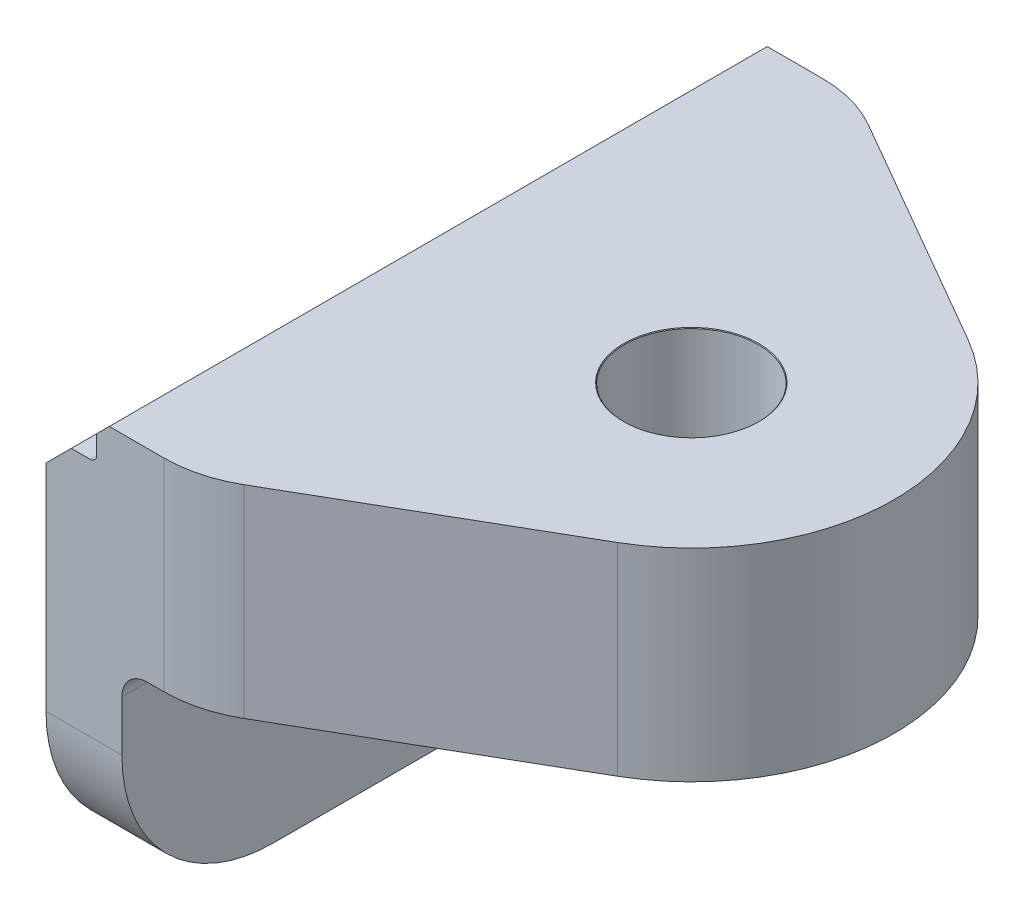
ISO-10303-21;
HEADER;
FILE_DESCRIPTION(('STEP AP214'),'2;1');
FILE_NAME('part.step','',(''),(''),'','','');
FILE_SCHEMA(('AUTOMOTIVE_DESIGN { 1 0 10303 214 1 1 1 1 }'));
ENDSEC;
DATA;
#1=APPLICATION_CONTEXT('core data for automotive mechanical design processes');
#2=APPLICATION_PROTOCOL_DEFINITION('international standard','automotive_design',2000,#1);
#3=PRODUCT_CONTEXT('',#1,'mechanical');
#4=PRODUCT('Part','Part','',(#3));
#5=PRODUCT_RELATED_PRODUCT_CATEGORY('part','',(#4));
#6=PRODUCT_DEFINITION_FORMATION('','',#4);
#7=PRODUCT_DEFINITION_CONTEXT('part definition',#1,'design');
#8=PRODUCT_DEFINITION('design','',#6,#7);
#9=PRODUCT_DEFINITION_SHAPE('','',#8);
#10=(LENGTH_UNIT() NAMED_UNIT(*) SI_UNIT(.MILLI.,.METRE.));
#11=(NAMED_UNIT(*) PLANE_ANGLE_UNIT() SI_UNIT($,.RADIAN.));
#12=(NAMED_UNIT(*) SI_UNIT($,.STERADIAN.) SOLID_ANGLE_UNIT());
#13=UNCERTAINTY_MEASURE_WITH_UNIT(LENGTH_MEASURE(1.E-05),#10,'distance_accuracy_value','');
#14=(GEOMETRIC_REPRESENTATION_CONTEXT(3) GLOBAL_UNCERTAINTY_ASSIGNED_CONTEXT((#13)) GLOBAL_UNIT_ASSIGNED_CONTEXT((#10,
#11,#12)) REPRESENTATION_CONTEXT('',''));
#15=CARTESIAN_POINT('',(0.,0.,0.));
#16=DIRECTION('',(0.,0.,1.));
#17=DIRECTION('',(1.,0.,0.));
#18=AXIS2_PLACEMENT_3D('',#15,#16,#17);
#19=CARTESIAN_POINT('',(3.,4.,13.));
#20=DIRECTION('',(0.,0.,-1.));
#21=DIRECTION('',(-1.,0.,0.));
#22=AXIS2_PLACEMENT_3D('',#19,#20,#21);
#23=PLANE('',#22);
#24=DIRECTION('',(1.,0.,0.));
#25=VECTOR('',#24,1.);
#26=CARTESIAN_POINT('',(3.,4.,13.));
#27=LINE('',#26,#25);
#28=CARTESIAN_POINT('',(-0.499999999999993,4.,13.));
#29=VERTEX_POINT('',#28);
#30=CARTESIAN_POINT('',(1.6602540378444,4.,13.));
#31=VERTEX_POINT('',#30);
#32=EDGE_CURVE('E236',#29,#31,#27,.T.);
#33=ORIENTED_EDGE('',*,*,#32,.F.);
#34=DIRECTION('',(-0.707106781186545,-0.70710678118655,0.));
#35=VECTOR('',#34,1.);
#36=CARTESIAN_POINT('',(-0.499999999999993,4.,13.));
#37=LINE('',#36,#35);
#38=CARTESIAN_POINT('',(-1.,3.49999999999999,13.));
#39=VERTEX_POINT('',#38);
#40=EDGE_CURVE('E69',#29,#39,#37,.T.);
#41=ORIENTED_EDGE('',*,*,#40,.T.);
#42=DIRECTION('',(0.,1.,0.));
#43=VECTOR('',#42,1.);
#44=CARTESIAN_POINT('',(-1.,2.,13.));
#45=LINE('',#44,#43);
#46=CARTESIAN_POINT('',(-1.,2.75,13.));
#47=VERTEX_POINT('',#46);
#48=EDGE_CURVE('E515',#47,#39,#45,.T.);
#49=ORIENTED_EDGE('',*,*,#48,.F.);
#50=CARTESIAN_POINT('',(-1.25,2.75,13.));
#51=DIRECTION('',(0.,0.,-1.));
#52=DIRECTION('',(-1.,0.,0.));
#53=AXIS2_PLACEMENT_3D('',#50,#51,#52);
#54=CIRCLE('',#53,0.25);
#55=CARTESIAN_POINT('',(-1.25,2.5,13.));
#56=VERTEX_POINT('',#55);
#57=EDGE_CURVE('E355',#47,#56,#54,.T.);
#58=ORIENTED_EDGE('',*,*,#57,.T.);
#59=DIRECTION('',(1.,0.,0.));
#60=VECTOR('',#59,1.);
#61=CARTESIAN_POINT('',(0.,2.5,13.));
#62=LINE('',#61,#60);
#63=CARTESIAN_POINT('',(-1.99999999999999,2.5,13.));
#64=VERTEX_POINT('',#63);
#65=EDGE_CURVE('E210',#64,#56,#62,.T.);
#66=ORIENTED_EDGE('',*,*,#65,.F.);
#67=DIRECTION('',(-0.707106781186548,-0.707106781186547,0.));
#68=VECTOR('',#67,1.);
#69=CARTESIAN_POINT('',(-1.99999999999999,2.5,13.));
#70=LINE('',#69,#68);
#71=CARTESIAN_POINT('',(-3.,1.5,13.));
#72=VERTEX_POINT('',#71);
#73=EDGE_CURVE('E363',#64,#72,#70,.T.);
#74=ORIENTED_EDGE('',*,*,#73,.T.);
#75=DIRECTION('',(0.,1.,0.));
#76=VECTOR('',#75,1.);
#77=CARTESIAN_POINT('',(-3.,-13.,13.));
#78=LINE('',#77,#76);
#79=CARTESIAN_POINT('',(-3.,-7.,13.));
#80=VERTEX_POINT('',#79);
#81=EDGE_CURVE('E225',#80,#72,#78,.T.);
#82=ORIENTED_EDGE('',*,*,#81,.F.);
#83=DIRECTION('',(1.,0.,0.));
#84=VECTOR('',#83,1.);
#85=CARTESIAN_POINT('',(0.,-7.,13.));
#86=LINE('',#85,#84);
#87=CARTESIAN_POINT('',(0.,-7.,13.));
#88=VERTEX_POINT('',#87);
#89=EDGE_CURVE('E278',#80,#88,#86,.T.);
#90=ORIENTED_EDGE('',*,*,#89,.T.);
#91=DIRECTION('',(0.,1.,0.));
#92=VECTOR('',#91,1.);
#93=CARTESIAN_POINT('',(0.,-13.,13.));
#94=LINE('',#93,#92);
#95=CARTESIAN_POINT('',(0.,-5.,13.));
#96=VERTEX_POINT('',#95);
#97=EDGE_CURVE('E220',#88,#96,#94,.T.);
#98=ORIENTED_EDGE('',*,*,#97,.T.);
#99=CARTESIAN_POINT('',(1.,-5.,13.));
#100=DIRECTION('',(0.,0.,-1.));
#101=DIRECTION('',(-1.,0.,0.));
#102=AXIS2_PLACEMENT_3D('',#99,#100,#101);
#103=CIRCLE('',#102,1.);
#104=CARTESIAN_POINT('',(1.,-4.,13.));
#105=VERTEX_POINT('',#104);
#106=EDGE_CURVE('E312',#96,#105,#103,.T.);
#107=ORIENTED_EDGE('',*,*,#106,.T.);
#108=DIRECTION('',(1.,0.,0.));
#109=VECTOR('',#108,1.);
#110=CARTESIAN_POINT('',(3.,-4.,13.));
#111=LINE('',#110,#109);
#112=CARTESIAN_POINT('',(1.6602540378444,-4.,13.));
#113=VERTEX_POINT('',#112);
#114=EDGE_CURVE('E224',#105,#113,#111,.T.);
#115=ORIENTED_EDGE('',*,*,#114,.T.);
#116=DIRECTION('',(0.,-1.,0.));
#117=VECTOR('',#116,1.);
#118=CARTESIAN_POINT('',(1.6602540378444,4.,13.));
#119=LINE('',#118,#117);
#120=EDGE_CURVE('E341',#113,#31,#119,.F.);
#121=ORIENTED_EDGE('',*,*,#120,.T.);
#122=EDGE_LOOP('',(#33,#41,#49,#58,#66,#74,#82,#90,#98,#107,#115,#121));
#123=FACE_BOUND('',#122,.T.);
#124=ADVANCED_FACE('F45',(#123),#23,.F.);
#125=CARTESIAN_POINT('',(25.5166604983955,4.,0.));
#126=DIRECTION('',(-0.499999999999995,0.,-0.866025403784441));
#127=DIRECTION('',(-0.866025403784441,0.,0.499999999999995));
#128=AXIS2_PLACEMENT_3D('',#125,#126,#127);
#129=PLANE('',#128);
#130=DIRECTION('',(0.866025403784441,0.,-0.499999999999995));
#131=VECTOR('',#130,1.);
#132=CARTESIAN_POINT('',(25.5166604983955,4.,0.));
#133=LINE('',#132,#131);
#134=CARTESIAN_POINT('',(4.16025403784439,4.,12.3301270189222));
#135=VERTEX_POINT('',#134);
#136=CARTESIAN_POINT('',(13.5166604983954,4.,6.92820323027558));
#137=VERTEX_POINT('',#136);
#138=EDGE_CURVE('E239',#135,#137,#133,.T.);
#139=ORIENTED_EDGE('',*,*,#138,.F.);
#140=DIRECTION('',(0.,-1.,0.));
#141=VECTOR('',#140,1.);
#142=CARTESIAN_POINT('',(4.16025403784438,4.,12.3301270189222));
#143=LINE('',#142,#141);
#144=CARTESIAN_POINT('',(4.16025403784439,-4.,12.3301270189222));
#145=VERTEX_POINT('',#144);
#146=EDGE_CURVE('E337',#135,#145,#143,.T.);
#147=ORIENTED_EDGE('',*,*,#146,.T.);
#148=DIRECTION('',(0.866025403784441,0.,-0.499999999999995));
#149=VECTOR('',#148,1.);
#150=CARTESIAN_POINT('',(25.5166604983955,-4.,0.));
#151=LINE('',#150,#149);
#152=CARTESIAN_POINT('',(13.5166604983954,-4.,6.92820323027558));
#153=VERTEX_POINT('',#152);
#154=EDGE_CURVE('E255',#145,#153,#151,.T.);
#155=ORIENTED_EDGE('',*,*,#154,.T.);
#156=DIRECTION('',(0.,-1.,0.));
#157=VECTOR('',#156,1.);
#158=CARTESIAN_POINT('',(13.5166604983954,4.,6.92820323027558));
#159=LINE('',#158,#157);
#160=EDGE_CURVE('E271',#153,#137,#159,.F.);
#161=ORIENTED_EDGE('',*,*,#160,.T.);
#162=EDGE_LOOP('',(#139,#147,#155,#161));
#163=FACE_BOUND('',#162,.T.);
#164=ADVANCED_FACE('F446',(#163),#129,.F.);
#165=CARTESIAN_POINT('',(3.,4.,-13.));
#166=DIRECTION('',(-0.500000000000001,0.,0.866025403784438));
#167=DIRECTION('',(0.866025403784438,0.,0.500000000000001));
#168=AXIS2_PLACEMENT_3D('',#165,#166,#167);
#169=PLANE('',#168);
#170=DIRECTION('',(-0.866025403784438,0.,-0.500000000000001));
#171=VECTOR('',#170,1.);
#172=CARTESIAN_POINT('',(3.,-4.,-13.));
#173=LINE('',#172,#171);
#174=CARTESIAN_POINT('',(13.5166604983955,-4.,-6.92820323027546));
#175=VERTEX_POINT('',#174);
#176=CARTESIAN_POINT('',(4.16025403784439,-4.,-12.3301270189222));
#177=VERTEX_POINT('',#176);
#178=EDGE_CURVE('E258',#175,#177,#173,.T.);
#179=ORIENTED_EDGE('',*,*,#178,.T.);
#180=DIRECTION('',(0.,-1.,0.));
#181=VECTOR('',#180,1.);
#182=CARTESIAN_POINT('',(4.16025403784439,4.,-12.3301270189222));
#183=LINE('',#182,#181);
#184=CARTESIAN_POINT('',(4.16025403784439,4.,-12.3301270189222));
#185=VERTEX_POINT('',#184);
#186=EDGE_CURVE('E328',#177,#185,#183,.F.);
#187=ORIENTED_EDGE('',*,*,#186,.T.);
#188=DIRECTION('',(-0.866025403784438,0.,-0.500000000000001));
#189=VECTOR('',#188,1.);
#190=CARTESIAN_POINT('',(3.,4.,-13.));
#191=LINE('',#190,#189);
#192=CARTESIAN_POINT('',(13.5166604983955,4.,-6.92820323027546));
#193=VERTEX_POINT('',#192);
#194=EDGE_CURVE('E243',#193,#185,#191,.T.);
#195=ORIENTED_EDGE('',*,*,#194,.F.);
#196=DIRECTION('',(0.,-1.,0.));
#197=VECTOR('',#196,1.);
#198=CARTESIAN_POINT('',(13.5166604983955,4.,-6.92820323027546));
#199=LINE('',#198,#197);
#200=EDGE_CURVE('E251',#193,#175,#199,.T.);
#201=ORIENTED_EDGE('',*,*,#200,.T.);
#202=EDGE_LOOP('',(#179,#187,#195,#201));
#203=FACE_BOUND('',#202,.T.);
#204=ADVANCED_FACE('F456',(#203),#169,.F.);
#205=CARTESIAN_POINT('',(0.,4.,-13.));
#206=DIRECTION('',(0.,0.,1.));
#207=DIRECTION('',(1.,0.,0.));
#208=AXIS2_PLACEMENT_3D('',#205,#206,#207);
#209=PLANE('',#208);
#210=DIRECTION('',(0.,1.,0.));
#211=VECTOR('',#210,1.);
#212=CARTESIAN_POINT('',(-1.,2.,-13.));
#213=LINE('',#212,#211);
#214=CARTESIAN_POINT('',(-1.,2.75,-13.));
#215=VERTEX_POINT('',#214);
#216=CARTESIAN_POINT('',(-1.,3.49999999999999,-13.));
#217=VERTEX_POINT('',#216);
#218=EDGE_CURVE('E465',#215,#217,#213,.T.);
#219=ORIENTED_EDGE('',*,*,#218,.T.);
#220=DIRECTION('',(0.707106781186545,0.70710678118655,0.));
#221=VECTOR('',#220,1.);
#222=CARTESIAN_POINT('',(-0.5,3.99999999999999,-13.));
#223=LINE('',#222,#221);
#224=CARTESIAN_POINT('',(-0.499999999999993,4.,-13.));
#225=VERTEX_POINT('',#224);
#226=EDGE_CURVE('E11',#217,#225,#223,.T.);
#227=ORIENTED_EDGE('',*,*,#226,.T.);
#228=DIRECTION('',(-1.,0.,0.));
#229=VECTOR('',#228,1.);
#230=CARTESIAN_POINT('',(0.,4.,-13.));
#231=LINE('',#230,#229);
#232=CARTESIAN_POINT('',(1.66025403784438,4.,-13.));
#233=VERTEX_POINT('',#232);
#234=EDGE_CURVE('E247',#233,#225,#231,.T.);
#235=ORIENTED_EDGE('',*,*,#234,.F.);
#236=DIRECTION('',(0.,-1.,0.));
#237=VECTOR('',#236,1.);
#238=CARTESIAN_POINT('',(1.66025403784438,4.,-13.));
#239=LINE('',#238,#237);
#240=CARTESIAN_POINT('',(1.66025403784438,-4.,-13.));
#241=VERTEX_POINT('',#240);
#242=EDGE_CURVE('E318',#233,#241,#239,.T.);
#243=ORIENTED_EDGE('',*,*,#242,.T.);
#244=DIRECTION('',(-1.,0.,0.));
#245=VECTOR('',#244,1.);
#246=CARTESIAN_POINT('',(0.,-4.,-13.));
#247=LINE('',#246,#245);
#248=CARTESIAN_POINT('',(0.999999999999999,-4.,-13.));
#249=VERTEX_POINT('',#248);
#250=EDGE_CURVE('E240',#241,#249,#247,.T.);
#251=ORIENTED_EDGE('',*,*,#250,.T.);
#252=CARTESIAN_POINT('',(0.999999999999999,-5.,-13.));
#253=DIRECTION('',(0.,0.,1.));
#254=DIRECTION('',(1.,0.,0.));
#255=AXIS2_PLACEMENT_3D('',#252,#253,#254);
#256=CIRCLE('',#255,1.);
#257=CARTESIAN_POINT('',(0.,-5.,-13.));
#258=VERTEX_POINT('',#257);
#259=EDGE_CURVE('E315',#249,#258,#256,.T.);
#260=ORIENTED_EDGE('',*,*,#259,.T.);
#261=DIRECTION('',(0.,1.,0.));
#262=VECTOR('',#261,1.);
#263=CARTESIAN_POINT('',(0.,-13.,-13.));
#264=LINE('',#263,#262);
#265=CARTESIAN_POINT('',(0.,-7.,-13.));
#266=VERTEX_POINT('',#265);
#267=EDGE_CURVE('E214',#266,#258,#264,.T.);
#268=ORIENTED_EDGE('',*,*,#267,.F.);
#269=DIRECTION('',(-1.,0.,0.));
#270=VECTOR('',#269,1.);
#271=CARTESIAN_POINT('',(-3.,-7.,-13.));
#272=LINE('',#271,#270);
#273=CARTESIAN_POINT('',(-3.,-7.,-13.));
#274=VERTEX_POINT('',#273);
#275=EDGE_CURVE('E300',#266,#274,#272,.T.);
#276=ORIENTED_EDGE('',*,*,#275,.T.);
#277=DIRECTION('',(0.,1.,0.));
#278=VECTOR('',#277,1.);
#279=CARTESIAN_POINT('',(-3.,-13.,-13.));
#280=LINE('',#279,#278);
#281=CARTESIAN_POINT('',(-3.,1.5,-13.));
#282=VERTEX_POINT('',#281);
#283=EDGE_CURVE('E229',#274,#282,#280,.T.);
#284=ORIENTED_EDGE('',*,*,#283,.T.);
#285=DIRECTION('',(0.707106781186548,0.707106781186547,0.));
#286=VECTOR('',#285,1.);
#287=CARTESIAN_POINT('',(-2.,2.49999999999999,-13.));
#288=LINE('',#287,#286);
#289=CARTESIAN_POINT('',(-2.,2.5,-13.));
#290=VERTEX_POINT('',#289);
#291=EDGE_CURVE('E369',#282,#290,#288,.T.);
#292=ORIENTED_EDGE('',*,*,#291,.T.);
#293=DIRECTION('',(-1.,0.,0.));
#294=VECTOR('',#293,1.);
#295=CARTESIAN_POINT('',(0.,2.5,-13.));
#296=LINE('',#295,#294);
#297=CARTESIAN_POINT('',(-1.25,2.5,-13.));
#298=VERTEX_POINT('',#297);
#299=EDGE_CURVE('E204',#298,#290,#296,.T.);
#300=ORIENTED_EDGE('',*,*,#299,.F.);
#301=CARTESIAN_POINT('',(-1.25,2.75,-13.));
#302=DIRECTION('',(0.,0.,1.));
#303=DIRECTION('',(1.,0.,0.));
#304=AXIS2_PLACEMENT_3D('',#301,#302,#303);
#305=CIRCLE('',#304,0.25);
#306=EDGE_CURVE('E352',#298,#215,#305,.T.);
#307=ORIENTED_EDGE('',*,*,#306,.T.);
#308=EDGE_LOOP('',(#219,#227,#235,#243,#251,#260,#268,#276,#284,#292,#300,#307));
#309=FACE_BOUND('',#308,.T.);
#310=ADVANCED_FACE('F463',(#309),#209,.F.);
#311=CARTESIAN_POINT('',(0.,4.,0.));
#312=DIRECTION('',(0.,-1.,0.));
#313=DIRECTION('',(0.,0.,-1.));
#314=AXIS2_PLACEMENT_3D('',#311,#312,#313);
#315=PLANE('',#314);
#316=CARTESIAN_POINT('',(9.5,4.,0.));
#317=DIRECTION('',(0.,-1.,0.));
#318=DIRECTION('',(0.,0.,-1.));
#319=AXIS2_PLACEMENT_3D('',#316,#317,#318);
#320=CIRCLE('',#319,2.675);
#321=CARTESIAN_POINT('',(9.5,4.,-2.675));
#322=VERTEX_POINT('',#321);
#323=EDGE_CURVE('E887',#322,#322,#320,.T.);
#324=ORIENTED_EDGE('',*,*,#323,.T.);
#325=EDGE_LOOP('',(#324));
#326=FACE_BOUND('',#325,.T.);
#327=ORIENTED_EDGE('',*,*,#234,.T.);
#328=DIRECTION('',(0.,0.,1.));
#329=VECTOR('',#328,1.);
#330=CARTESIAN_POINT('',(-0.499999999999993,4.,13.));
#331=LINE('',#330,#329);
#332=EDGE_CURVE('E372',#225,#29,#331,.T.);
#333=ORIENTED_EDGE('',*,*,#332,.T.);
#334=ORIENTED_EDGE('',*,*,#32,.T.);
#335=CARTESIAN_POINT('',(1.6602540378444,4.,8.));
#336=DIRECTION('',(0.,-1.,0.));
#337=DIRECTION('',(0.,0.,-1.));
#338=AXIS2_PLACEMENT_3D('',#335,#336,#337);
#339=CIRCLE('',#338,5.);
#340=EDGE_CURVE('E331',#31,#135,#339,.F.);
#341=ORIENTED_EDGE('',*,*,#340,.T.);
#342=ORIENTED_EDGE('',*,*,#138,.T.);
#343=CARTESIAN_POINT('',(9.51666049839545,4.,0.));
#344=DIRECTION('',(0.,-1.,0.));
#345=DIRECTION('',(0.,0.,-1.));
#346=AXIS2_PLACEMENT_3D('',#343,#344,#345);
#347=CIRCLE('',#346,8.);
#348=EDGE_CURVE('E275',#137,#193,#347,.F.);
#349=ORIENTED_EDGE('',*,*,#348,.T.);
#350=ORIENTED_EDGE('',*,*,#194,.T.);
#351=CARTESIAN_POINT('',(1.66025403784439,4.,-8.));
#352=DIRECTION('',(0.,-1.,0.));
#353=DIRECTION('',(0.,0.,-1.));
#354=AXIS2_PLACEMENT_3D('',#351,#352,#353);
#355=CIRCLE('',#354,5.);
#356=EDGE_CURVE('E334',#185,#233,#355,.F.);
#357=ORIENTED_EDGE('',*,*,#356,.T.);
#358=EDGE_LOOP('',(#327,#333,#334,#341,#342,#349,#350,#357));
#359=FACE_BOUND('',#358,.T.);
#360=ADVANCED_FACE('F434',(#326,#359),#315,.F.);
#361=CARTESIAN_POINT('',(0.,-4.,0.));
#362=DIRECTION('',(0.,-1.,0.));
#363=DIRECTION('',(0.,0.,-1.));
#364=AXIS2_PLACEMENT_3D('',#361,#362,#363);
#365=PLANE('',#364);
#366=CARTESIAN_POINT('',(9.5,-4.,0.));
#367=DIRECTION('',(0.,-1.,0.));
#368=DIRECTION('',(0.,0.,-1.));
#369=AXIS2_PLACEMENT_3D('',#366,#367,#368);
#370=CIRCLE('',#369,5.);
#371=CARTESIAN_POINT('',(9.5,-4.,-5.));
#372=VERTEX_POINT('',#371);
#373=EDGE_CURVE('E885',#372,#372,#370,.T.);
#374=ORIENTED_EDGE('',*,*,#373,.F.);
#375=EDGE_LOOP('',(#374));
#376=FACE_BOUND('',#375,.T.);
#377=ORIENTED_EDGE('',*,*,#250,.F.);
#378=CARTESIAN_POINT('',(1.66025403784439,-4.,-8.));
#379=DIRECTION('',(0.,-1.,0.));
#380=DIRECTION('',(0.,0.,-1.));
#381=AXIS2_PLACEMENT_3D('',#378,#379,#380);
#382=CIRCLE('',#381,5.);
#383=EDGE_CURVE('E325',#241,#177,#382,.T.);
#384=ORIENTED_EDGE('',*,*,#383,.T.);
#385=ORIENTED_EDGE('',*,*,#178,.F.);
#386=CARTESIAN_POINT('',(9.51666049839545,-4.,0.));
#387=DIRECTION('',(0.,-1.,0.));
#388=DIRECTION('',(0.,0.,-1.));
#389=AXIS2_PLACEMENT_3D('',#386,#387,#388);
#390=CIRCLE('',#389,8.);
#391=EDGE_CURVE('E267',#175,#153,#390,.T.);
#392=ORIENTED_EDGE('',*,*,#391,.T.);
#393=ORIENTED_EDGE('',*,*,#154,.F.);
#394=CARTESIAN_POINT('',(1.6602540378444,-4.,8.));
#395=DIRECTION('',(0.,-1.,0.));
#396=DIRECTION('',(0.,0.,-1.));
#397=AXIS2_PLACEMENT_3D('',#394,#395,#396);
#398=CIRCLE('',#397,5.);
#399=EDGE_CURVE('E322',#145,#113,#398,.T.);
#400=ORIENTED_EDGE('',*,*,#399,.T.);
#401=ORIENTED_EDGE('',*,*,#114,.F.);
#402=DIRECTION('',(0.,0.,1.));
#403=VECTOR('',#402,1.);
#404=CARTESIAN_POINT('',(0.999999999999999,-4.,-13.));
#405=LINE('',#404,#403);
#406=EDGE_CURVE('E308',#105,#249,#405,.F.);
#407=ORIENTED_EDGE('',*,*,#406,.T.);
#408=EDGE_LOOP('',(#377,#384,#385,#392,#393,#400,#401,#407));
#409=FACE_BOUND('',#408,.T.);
#410=ADVANCED_FACE('F484',(#376,#409),#365,.T.);
#411=CARTESIAN_POINT('',(9.51666049839545,4.,0.));
#412=DIRECTION('',(0.,-1.,0.));
#413=DIRECTION('',(0.,0.,-1.));
#414=AXIS2_PLACEMENT_3D('',#411,#412,#413);
#415=CYLINDRICAL_SURFACE('',#414,8.);
#416=ORIENTED_EDGE('',*,*,#348,.F.);
#417=ORIENTED_EDGE('',*,*,#160,.F.);
#418=ORIENTED_EDGE('',*,*,#391,.F.);
#419=ORIENTED_EDGE('',*,*,#200,.F.);
#420=EDGE_LOOP('',(#416,#417,#418,#419));
#421=FACE_BOUND('',#420,.T.);
#422=ADVANCED_FACE('F452',(#421),#415,.T.);
#423=CARTESIAN_POINT('',(0.,-13.,-13.));
#424=DIRECTION('',(1.,0.,0.));
#425=DIRECTION('',(0.,0.,-1.));
#426=AXIS2_PLACEMENT_3D('',#423,#424,#425);
#427=PLANE('',#426);
#428=CARTESIAN_POINT('',(0.,-8.,-5.));
#429=DIRECTION('',(1.,0.,0.));
#430=DIRECTION('',(0.,0.,-1.));
#431=AXIS2_PLACEMENT_3D('',#428,#429,#430);
#432=CIRCLE('',#431,1.7);
#433=CARTESIAN_POINT('',(0.,-8.,-6.7));
#434=VERTEX_POINT('',#433);
#435=EDGE_CURVE('E523',#434,#434,#432,.T.);
#436=ORIENTED_EDGE('',*,*,#435,.F.);
#437=EDGE_LOOP('',(#436));
#438=FACE_BOUND('',#437,.T.);
#439=CARTESIAN_POINT('',(0.,-8.,5.));
#440=DIRECTION('',(1.,0.,0.));
#441=DIRECTION('',(0.,0.,-1.));
#442=AXIS2_PLACEMENT_3D('',#439,#440,#441);
#443=CIRCLE('',#442,1.7);
#444=CARTESIAN_POINT('',(0.,-8.,3.3));
#445=VERTEX_POINT('',#444);
#446=EDGE_CURVE('E197',#445,#445,#443,.T.);
#447=ORIENTED_EDGE('',*,*,#446,.F.);
#448=EDGE_LOOP('',(#447));
#449=FACE_BOUND('',#448,.T.);
#450=ORIENTED_EDGE('',*,*,#267,.T.);
#451=DIRECTION('',(0.,0.,1.));
#452=VECTOR('',#451,1.);
#453=CARTESIAN_POINT('',(0.,-5.,13.));
#454=LINE('',#453,#452);
#455=EDGE_CURVE('E304',#258,#96,#454,.T.);
#456=ORIENTED_EDGE('',*,*,#455,.T.);
#457=ORIENTED_EDGE('',*,*,#97,.F.);
#458=CARTESIAN_POINT('',(0.,-7.,7.));
#459=DIRECTION('',(1.,0.,0.));
#460=DIRECTION('',(0.,0.,-1.));
#461=AXIS2_PLACEMENT_3D('',#458,#459,#460);
#462=CIRCLE('',#461,6.);
#463=CARTESIAN_POINT('',(0.,-13.,6.99999999999999));
#464=VERTEX_POINT('',#463);
#465=EDGE_CURVE('E285',#88,#464,#462,.T.);
#466=ORIENTED_EDGE('',*,*,#465,.T.);
#467=DIRECTION('',(0.,0.,-1.));
#468=VECTOR('',#467,1.);
#469=CARTESIAN_POINT('',(0.,-13.,-13.));
#470=LINE('',#469,#468);
#471=CARTESIAN_POINT('',(0.,-13.,-7.));
#472=VERTEX_POINT('',#471);
#473=EDGE_CURVE('E205',#464,#472,#470,.T.);
#474=ORIENTED_EDGE('',*,*,#473,.T.);
#475=CARTESIAN_POINT('',(0.,-7.,-7.));
#476=DIRECTION('',(1.,0.,0.));
#477=DIRECTION('',(0.,0.,-1.));
#478=AXIS2_PLACEMENT_3D('',#475,#476,#477);
#479=CIRCLE('',#478,6.);
#480=EDGE_CURVE('E282',#472,#266,#479,.T.);
#481=ORIENTED_EDGE('',*,*,#480,.T.);
#482=EDGE_LOOP('',(#450,#456,#457,#466,#474,#481));
#483=FACE_BOUND('',#482,.T.);
#484=ADVANCED_FACE('F483',(#438,#449,#483),#427,.T.);
#485=CARTESIAN_POINT('',(-3.,-13.,-13.));
#486=DIRECTION('',(-1.,0.,0.));
#487=DIRECTION('',(0.,0.,1.));
#488=AXIS2_PLACEMENT_3D('',#485,#486,#487);
#489=PLANE('',#488);
#490=CARTESIAN_POINT('',(-3.,-8.,-5.));
#491=DIRECTION('',(-1.,0.,0.));
#492=DIRECTION('',(0.,0.,1.));
#493=AXIS2_PLACEMENT_3D('',#490,#491,#492);
#494=CIRCLE('',#493,1.7);
#495=CARTESIAN_POINT('',(-3.,-8.,-3.3));
#496=VERTEX_POINT('',#495);
#497=EDGE_CURVE('E517',#496,#496,#494,.T.);
#498=ORIENTED_EDGE('',*,*,#497,.F.);
#499=EDGE_LOOP('',(#498));
#500=FACE_BOUND('',#499,.T.);
#501=CARTESIAN_POINT('',(-3.,-8.,5.));
#502=DIRECTION('',(-1.,0.,0.));
#503=DIRECTION('',(0.,0.,1.));
#504=AXIS2_PLACEMENT_3D('',#501,#502,#503);
#505=CIRCLE('',#504,1.7);
#506=CARTESIAN_POINT('',(-3.,-8.,6.7));
#507=VERTEX_POINT('',#506);
#508=EDGE_CURVE('E533',#507,#507,#505,.T.);
#509=ORIENTED_EDGE('',*,*,#508,.F.);
#510=EDGE_LOOP('',(#509));
#511=FACE_BOUND('',#510,.T.);
#512=CARTESIAN_POINT('',(-3.,-1.,9.5));
#513=DIRECTION('',(-1.,0.,0.));
#514=DIRECTION('',(0.,0.,1.));
#515=AXIS2_PLACEMENT_3D('',#512,#513,#514);
#516=CIRCLE('',#515,1.25);
#517=CARTESIAN_POINT('',(-3.,-1.,10.75));
#518=VERTEX_POINT('',#517);
#519=EDGE_CURVE('E188',#518,#518,#516,.T.);
#520=ORIENTED_EDGE('',*,*,#519,.F.);
#521=EDGE_LOOP('',(#520));
#522=FACE_BOUND('',#521,.T.);
#523=CARTESIAN_POINT('',(-3.,-1.,-9.5));
#524=DIRECTION('',(-1.,0.,0.));
#525=DIRECTION('',(0.,0.,1.));
#526=AXIS2_PLACEMENT_3D('',#523,#524,#525);
#527=CIRCLE('',#526,1.25);
#528=CARTESIAN_POINT('',(-3.,-1.,-8.25));
#529=VERTEX_POINT('',#528);
#530=EDGE_CURVE('E187',#529,#529,#527,.T.);
#531=ORIENTED_EDGE('',*,*,#530,.F.);
#532=EDGE_LOOP('',(#531));
#533=FACE_BOUND('',#532,.T.);
#534=ORIENTED_EDGE('',*,*,#81,.T.);
#535=DIRECTION('',(0.,0.,-1.));
#536=VECTOR('',#535,1.);
#537=CARTESIAN_POINT('',(-3.,1.5,-13.));
#538=LINE('',#537,#536);
#539=EDGE_CURVE('E366',#72,#282,#538,.T.);
#540=ORIENTED_EDGE('',*,*,#539,.T.);
#541=ORIENTED_EDGE('',*,*,#283,.F.);
#542=CARTESIAN_POINT('',(-3.,-7.,-6.99999999999999));
#543=DIRECTION('',(-1.,0.,0.));
#544=DIRECTION('',(0.,0.,1.));
#545=AXIS2_PLACEMENT_3D('',#542,#543,#544);
#546=CIRCLE('',#545,6.);
#547=CARTESIAN_POINT('',(-3.,-13.,-7.));
#548=VERTEX_POINT('',#547);
#549=EDGE_CURVE('E294',#274,#548,#546,.T.);
#550=ORIENTED_EDGE('',*,*,#549,.T.);
#551=DIRECTION('',(0.,0.,1.));
#552=VECTOR('',#551,1.);
#553=CARTESIAN_POINT('',(-3.,-13.,-13.));
#554=LINE('',#553,#552);
#555=CARTESIAN_POINT('',(-3.,-13.,6.99999999999999));
#556=VERTEX_POINT('',#555);
#557=EDGE_CURVE('E209',#548,#556,#554,.T.);
#558=ORIENTED_EDGE('',*,*,#557,.T.);
#559=CARTESIAN_POINT('',(-3.,-7.,7.));
#560=DIRECTION('',(-1.,0.,0.));
#561=DIRECTION('',(0.,0.,1.));
#562=AXIS2_PLACEMENT_3D('',#559,#560,#561);
#563=CIRCLE('',#562,6.);
#564=EDGE_CURVE('E297',#556,#80,#563,.T.);
#565=ORIENTED_EDGE('',*,*,#564,.T.);
#566=EDGE_LOOP('',(#534,#540,#541,#550,#558,#565));
#567=FACE_BOUND('',#566,.T.);
#568=ADVANCED_FACE('F546',(#500,#511,#522,#533,#567),#489,.T.);
#569=CARTESIAN_POINT('',(0.,-13.,0.));
#570=DIRECTION('',(0.,-1.,0.));
#571=DIRECTION('',(0.,0.,-1.));
#572=AXIS2_PLACEMENT_3D('',#569,#570,#571);
#573=PLANE('',#572);
#574=ORIENTED_EDGE('',*,*,#473,.F.);
#575=DIRECTION('',(1.,0.,0.));
#576=VECTOR('',#575,1.);
#577=CARTESIAN_POINT('',(-3.,-13.,7.));
#578=LINE('',#577,#576);
#579=EDGE_CURVE('E291',#464,#556,#578,.F.);
#580=ORIENTED_EDGE('',*,*,#579,.T.);
#581=ORIENTED_EDGE('',*,*,#557,.F.);
#582=DIRECTION('',(-1.,0.,0.));
#583=VECTOR('',#582,1.);
#584=CARTESIAN_POINT('',(0.,-13.,-7.));
#585=LINE('',#584,#583);
#586=EDGE_CURVE('E288',#548,#472,#585,.F.);
#587=ORIENTED_EDGE('',*,*,#586,.T.);
#588=EDGE_LOOP('',(#574,#580,#581,#587));
#589=FACE_BOUND('',#588,.T.);
#590=ADVANCED_FACE('F611',(#589),#573,.T.);
#591=CARTESIAN_POINT('',(0.,2.5,0.));
#592=DIRECTION('',(0.,-1.,0.));
#593=DIRECTION('',(0.,0.,-1.));
#594=AXIS2_PLACEMENT_3D('',#591,#592,#593);
#595=PLANE('',#594);
#596=ORIENTED_EDGE('',*,*,#299,.T.);
#597=DIRECTION('',(0.,0.,1.));
#598=VECTOR('',#597,1.);
#599=CARTESIAN_POINT('',(-1.99999999999999,2.5,13.));
#600=LINE('',#599,#598);
#601=EDGE_CURVE('E359',#290,#64,#600,.T.);
#602=ORIENTED_EDGE('',*,*,#601,.T.);
#603=ORIENTED_EDGE('',*,*,#65,.T.);
#604=DIRECTION('',(0.,0.,-1.));
#605=VECTOR('',#604,1.);
#606=CARTESIAN_POINT('',(-1.25,2.5,0.));
#607=LINE('',#606,#605);
#608=EDGE_CURVE('E345',#56,#298,#607,.T.);
#609=ORIENTED_EDGE('',*,*,#608,.T.);
#610=EDGE_LOOP('',(#596,#602,#603,#609));
#611=FACE_BOUND('',#610,.T.);
#612=ADVANCED_FACE('F623',(#611),#595,.F.);
#613=CARTESIAN_POINT('',(4.5,-1.,-9.5));
#614=DIRECTION('',(-1.,0.,0.));
#615=DIRECTION('',(0.,0.,1.));
#616=AXIS2_PLACEMENT_3D('',#613,#614,#615);
#617=CONICAL_SURFACE('',#616,1.25,1.02974425867665);
#618=CARTESIAN_POINT('',(5.25107577378445,-1.,-9.5));
#619=VERTEX_POINT('',#618);
#620=VERTEX_LOOP('',#619);
#621=FACE_BOUND('',#620,.T.);
#622=CARTESIAN_POINT('',(4.5,-1.,-9.5));
#623=DIRECTION('',(-1.,0.,0.));
#624=DIRECTION('',(0.,0.,1.));
#625=AXIS2_PLACEMENT_3D('',#622,#623,#624);
#626=CIRCLE('',#625,1.25);
#627=CARTESIAN_POINT('',(4.5,-1.,-8.25));
#628=VERTEX_POINT('',#627);
#629=EDGE_CURVE('E194',#628,#628,#626,.T.);
#630=ORIENTED_EDGE('',*,*,#629,.T.);
#631=EDGE_LOOP('',(#630));
#632=FACE_BOUND('',#631,.T.);
#633=ADVANCED_FACE('F634',(#621,#632),#617,.F.);
#634=CARTESIAN_POINT('',(-3.,-1.,-9.5));
#635=DIRECTION('',(-1.,0.,0.));
#636=DIRECTION('',(0.,0.,1.));
#637=AXIS2_PLACEMENT_3D('',#634,#635,#636);
#638=CYLINDRICAL_SURFACE('',#637,1.25);
#639=ORIENTED_EDGE('',*,*,#629,.F.);
#640=EDGE_LOOP('',(#639));
#641=FACE_BOUND('',#640,.T.);
#642=ORIENTED_EDGE('',*,*,#530,.T.);
#643=EDGE_LOOP('',(#642));
#644=FACE_BOUND('',#643,.T.);
#645=ADVANCED_FACE('F180',(#641,#644),#638,.F.);
#646=CARTESIAN_POINT('',(4.5,-1.,9.5));
#647=DIRECTION('',(-1.,0.,0.));
#648=DIRECTION('',(0.,0.,1.));
#649=AXIS2_PLACEMENT_3D('',#646,#647,#648);
#650=CONICAL_SURFACE('',#649,1.25,1.02974425867665);
#651=CARTESIAN_POINT('',(5.25107577378445,-1.,9.5));
#652=VERTEX_POINT('',#651);
#653=VERTEX_LOOP('',#652);
#654=FACE_BOUND('',#653,.T.);
#655=CARTESIAN_POINT('',(4.5,-1.,9.5));
#656=DIRECTION('',(-1.,0.,0.));
#657=DIRECTION('',(0.,0.,1.));
#658=AXIS2_PLACEMENT_3D('',#655,#656,#657);
#659=CIRCLE('',#658,1.25);
#660=CARTESIAN_POINT('',(4.5,-1.,10.75));
#661=VERTEX_POINT('',#660);
#662=EDGE_CURVE('E184',#661,#661,#659,.T.);
#663=ORIENTED_EDGE('',*,*,#662,.T.);
#664=EDGE_LOOP('',(#663));
#665=FACE_BOUND('',#664,.T.);
#666=ADVANCED_FACE('F176',(#654,#665),#650,.F.);
#667=CARTESIAN_POINT('',(-3.,-1.,9.5));
#668=DIRECTION('',(-1.,0.,0.));
#669=DIRECTION('',(0.,0.,1.));
#670=AXIS2_PLACEMENT_3D('',#667,#668,#669);
#671=CYLINDRICAL_SURFACE('',#670,1.25);
#672=ORIENTED_EDGE('',*,*,#662,.F.);
#673=EDGE_LOOP('',(#672));
#674=FACE_BOUND('',#673,.T.);
#675=ORIENTED_EDGE('',*,*,#519,.T.);
#676=EDGE_LOOP('',(#675));
#677=FACE_BOUND('',#676,.T.);
#678=ADVANCED_FACE('F179',(#674,#677),#671,.F.);
#679=CARTESIAN_POINT('',(-3.,-8.,5.));
#680=DIRECTION('',(-1.,0.,0.));
#681=DIRECTION('',(0.,0.,1.));
#682=AXIS2_PLACEMENT_3D('',#679,#680,#681);
#683=CYLINDRICAL_SURFACE('',#682,1.7);
#684=ORIENTED_EDGE('',*,*,#446,.T.);
#685=EDGE_LOOP('',(#684));
#686=FACE_BOUND('',#685,.T.);
#687=ORIENTED_EDGE('',*,*,#508,.T.);
#688=EDGE_LOOP('',(#687));
#689=FACE_BOUND('',#688,.T.);
#690=ADVANCED_FACE('F541',(#686,#689),#683,.F.);
#691=CARTESIAN_POINT('',(-3.,-8.,-5.));
#692=DIRECTION('',(-1.,0.,0.));
#693=DIRECTION('',(0.,0.,1.));
#694=AXIS2_PLACEMENT_3D('',#691,#692,#693);
#695=CYLINDRICAL_SURFACE('',#694,1.7);
#696=ORIENTED_EDGE('',*,*,#435,.T.);
#697=EDGE_LOOP('',(#696));
#698=FACE_BOUND('',#697,.T.);
#699=ORIENTED_EDGE('',*,*,#497,.T.);
#700=EDGE_LOOP('',(#699));
#701=FACE_BOUND('',#700,.T.);
#702=ADVANCED_FACE('F677',(#698,#701),#695,.F.);
#703=CARTESIAN_POINT('',(-1.,2.,13.));
#704=DIRECTION('',(-1.,0.,0.));
#705=DIRECTION('',(0.,0.,1.));
#706=AXIS2_PLACEMENT_3D('',#703,#704,#705);
#707=PLANE('',#706);
#708=ORIENTED_EDGE('',*,*,#48,.T.);
#709=DIRECTION('',(0.,0.,-1.));
#710=VECTOR('',#709,1.);
#711=CARTESIAN_POINT('',(-1.,3.49999999999999,-13.));
#712=LINE('',#711,#710);
#713=EDGE_CURVE('E55',#39,#217,#712,.T.);
#714=ORIENTED_EDGE('',*,*,#713,.T.);
#715=ORIENTED_EDGE('',*,*,#218,.F.);
#716=DIRECTION('',(0.,0.,-1.));
#717=VECTOR('',#716,1.);
#718=CARTESIAN_POINT('',(-1.,2.75,13.));
#719=LINE('',#718,#717);
#720=EDGE_CURVE('E349',#215,#47,#719,.F.);
#721=ORIENTED_EDGE('',*,*,#720,.T.);
#722=EDGE_LOOP('',(#708,#714,#715,#721));
#723=FACE_BOUND('',#722,.T.);
#724=ADVANCED_FACE('F685',(#723),#707,.T.);
#725=CARTESIAN_POINT('',(9.5,3.975,0.));
#726=DIRECTION('',(0.,1.,0.));
#727=DIRECTION('',(0.,0.,1.));
#728=AXIS2_PLACEMENT_3D('',#725,#726,#727);
#729=CONICAL_SURFACE('',#728,2.65,0.785398163397448);
#730=ORIENTED_EDGE('',*,*,#323,.F.);
#731=EDGE_LOOP('',(#730));
#732=FACE_BOUND('',#731,.T.);
#733=CARTESIAN_POINT('',(9.5,3.975,0.));
#734=DIRECTION('',(0.,-1.,0.));
#735=DIRECTION('',(0.,0.,-1.));
#736=AXIS2_PLACEMENT_3D('',#733,#734,#735);
#737=CIRCLE('',#736,2.65);
#738=CARTESIAN_POINT('',(9.5,3.975,-2.65));
#739=VERTEX_POINT('',#738);
#740=EDGE_CURVE('E525',#739,#739,#737,.T.);
#741=ORIENTED_EDGE('',*,*,#740,.T.);
#742=EDGE_LOOP('',(#741));
#743=FACE_BOUND('',#742,.T.);
#744=ADVANCED_FACE('F694',(#732,#743),#729,.F.);
#745=CARTESIAN_POINT('',(9.5,-4.,0.));
#746=DIRECTION('',(0.,-1.,0.));
#747=DIRECTION('',(0.,0.,-1.));
#748=AXIS2_PLACEMENT_3D('',#745,#746,#747);
#749=CYLINDRICAL_SURFACE('',#748,2.65);
#750=ORIENTED_EDGE('',*,*,#740,.F.);
#751=EDGE_LOOP('',(#750));
#752=FACE_BOUND('',#751,.T.);
#753=CARTESIAN_POINT('',(9.5,0.024999999999999,0.));
#754=DIRECTION('',(0.,-1.,0.));
#755=DIRECTION('',(0.,0.,-1.));
#756=AXIS2_PLACEMENT_3D('',#753,#754,#755);
#757=CIRCLE('',#756,2.65);
#758=CARTESIAN_POINT('',(9.5,0.024999999999999,-2.65));
#759=VERTEX_POINT('',#758);
#760=EDGE_CURVE('E899',#759,#759,#757,.T.);
#761=ORIENTED_EDGE('',*,*,#760,.T.);
#762=EDGE_LOOP('',(#761));
#763=FACE_BOUND('',#762,.T.);
#764=ADVANCED_FACE('F704',(#752,#763),#749,.F.);
#765=CARTESIAN_POINT('',(9.5,0.,0.));
#766=DIRECTION('',(0.,-1.,0.));
#767=DIRECTION('',(0.,0.,-1.));
#768=AXIS2_PLACEMENT_3D('',#765,#766,#767);
#769=CONICAL_SURFACE('',#768,2.675,0.785398163397466);
#770=ORIENTED_EDGE('',*,*,#760,.F.);
#771=EDGE_LOOP('',(#770));
#772=FACE_BOUND('',#771,.T.);
#773=CARTESIAN_POINT('',(9.5,0.,0.));
#774=DIRECTION('',(0.,-1.,0.));
#775=DIRECTION('',(0.,0.,-1.));
#776=AXIS2_PLACEMENT_3D('',#773,#774,#775);
#777=CIRCLE('',#776,2.675);
#778=CARTESIAN_POINT('',(9.5,0.,-2.675));
#779=VERTEX_POINT('',#778);
#780=EDGE_CURVE('E892',#779,#779,#777,.T.);
#781=ORIENTED_EDGE('',*,*,#780,.T.);
#782=EDGE_LOOP('',(#781));
#783=FACE_BOUND('',#782,.T.);
#784=ADVANCED_FACE('F714',(#772,#783),#769,.F.);
#785=CARTESIAN_POINT('',(12.175,0.,0.));
#786=DIRECTION('',(0.,1.,0.));
#787=DIRECTION('',(0.,0.,1.));
#788=AXIS2_PLACEMENT_3D('',#785,#786,#787);
#789=PLANE('',#788);
#790=ORIENTED_EDGE('',*,*,#780,.F.);
#791=EDGE_LOOP('',(#790));
#792=FACE_BOUND('',#791,.T.);
#793=CARTESIAN_POINT('',(9.5,0.,0.));
#794=DIRECTION('',(0.,-1.,0.));
#795=DIRECTION('',(0.,0.,-1.));
#796=AXIS2_PLACEMENT_3D('',#793,#794,#795);
#797=CIRCLE('',#796,5.);
#798=CARTESIAN_POINT('',(9.5,0.,-5.));
#799=VERTEX_POINT('',#798);
#800=EDGE_CURVE('E883',#799,#799,#797,.T.);
#801=ORIENTED_EDGE('',*,*,#800,.T.);
#802=EDGE_LOOP('',(#801));
#803=FACE_BOUND('',#802,.T.);
#804=ADVANCED_FACE('F724',(#792,#803),#789,.F.);
#805=CARTESIAN_POINT('',(9.5,-4.,0.));
#806=DIRECTION('',(0.,-1.,0.));
#807=DIRECTION('',(0.,0.,-1.));
#808=AXIS2_PLACEMENT_3D('',#805,#806,#807);
#809=CYLINDRICAL_SURFACE('',#808,5.);
#810=ORIENTED_EDGE('',*,*,#800,.F.);
#811=EDGE_LOOP('',(#810));
#812=FACE_BOUND('',#811,.T.);
#813=ORIENTED_EDGE('',*,*,#373,.T.);
#814=EDGE_LOOP('',(#813));
#815=FACE_BOUND('',#814,.T.);
#816=ADVANCED_FACE('F489',(#812,#815),#809,.F.);
#817=CARTESIAN_POINT('',(3.,-7.,7.));
#818=DIRECTION('',(-1.,0.,0.));
#819=DIRECTION('',(0.,0.,1.));
#820=AXIS2_PLACEMENT_3D('',#817,#818,#819);
#821=CYLINDRICAL_SURFACE('',#820,6.);
#822=ORIENTED_EDGE('',*,*,#564,.F.);
#823=ORIENTED_EDGE('',*,*,#579,.F.);
#824=ORIENTED_EDGE('',*,*,#465,.F.);
#825=ORIENTED_EDGE('',*,*,#89,.F.);
#826=EDGE_LOOP('',(#822,#823,#824,#825));
#827=FACE_BOUND('',#826,.T.);
#828=ADVANCED_FACE('F485',(#827),#821,.T.);
#829=CARTESIAN_POINT('',(0.,-7.,-7.));
#830=DIRECTION('',(1.,0.,0.));
#831=DIRECTION('',(0.,0.,-1.));
#832=AXIS2_PLACEMENT_3D('',#829,#830,#831);
#833=CYLINDRICAL_SURFACE('',#832,6.);
#834=ORIENTED_EDGE('',*,*,#480,.F.);
#835=ORIENTED_EDGE('',*,*,#586,.F.);
#836=ORIENTED_EDGE('',*,*,#549,.F.);
#837=ORIENTED_EDGE('',*,*,#275,.F.);
#838=EDGE_LOOP('',(#834,#835,#836,#837));
#839=FACE_BOUND('',#838,.T.);
#840=ADVANCED_FACE('F488',(#839),#833,.T.);
#841=CARTESIAN_POINT('',(0.999999999999999,-5.,-13.));
#842=DIRECTION('',(0.,0.,-1.));
#843=DIRECTION('',(-1.,0.,0.));
#844=AXIS2_PLACEMENT_3D('',#841,#842,#843);
#845=CYLINDRICAL_SURFACE('',#844,1.);
#846=ORIENTED_EDGE('',*,*,#259,.F.);
#847=ORIENTED_EDGE('',*,*,#406,.F.);
#848=ORIENTED_EDGE('',*,*,#106,.F.);
#849=ORIENTED_EDGE('',*,*,#455,.F.);
#850=EDGE_LOOP('',(#846,#847,#848,#849));
#851=FACE_BOUND('',#850,.T.);
#852=ADVANCED_FACE('F493',(#851),#845,.F.);
#853=CARTESIAN_POINT('',(1.66025403784439,4.,-8.));
#854=DIRECTION('',(0.,-1.,0.));
#855=DIRECTION('',(0.,0.,-1.));
#856=AXIS2_PLACEMENT_3D('',#853,#854,#855);
#857=CYLINDRICAL_SURFACE('',#856,5.);
#858=ORIENTED_EDGE('',*,*,#356,.F.);
#859=ORIENTED_EDGE('',*,*,#186,.F.);
#860=ORIENTED_EDGE('',*,*,#383,.F.);
#861=ORIENTED_EDGE('',*,*,#242,.F.);
#862=EDGE_LOOP('',(#858,#859,#860,#861));
#863=FACE_BOUND('',#862,.T.);
#864=ADVANCED_FACE('F460',(#863),#857,.T.);
#865=CARTESIAN_POINT('',(1.6602540378444,4.,8.));
#866=DIRECTION('',(0.,-1.,0.));
#867=DIRECTION('',(0.,0.,-1.));
#868=AXIS2_PLACEMENT_3D('',#865,#866,#867);
#869=CYLINDRICAL_SURFACE('',#868,5.);
#870=ORIENTED_EDGE('',*,*,#340,.F.);
#871=ORIENTED_EDGE('',*,*,#120,.F.);
#872=ORIENTED_EDGE('',*,*,#399,.F.);
#873=ORIENTED_EDGE('',*,*,#146,.F.);
#874=EDGE_LOOP('',(#870,#871,#872,#873));
#875=FACE_BOUND('',#874,.T.);
#876=ADVANCED_FACE('F443',(#875),#869,.T.);
#877=CARTESIAN_POINT('',(-1.25,2.75,0.));
#878=DIRECTION('',(0.,0.,-1.));
#879=DIRECTION('',(-1.,0.,0.));
#880=AXIS2_PLACEMENT_3D('',#877,#878,#879);
#881=CYLINDRICAL_SURFACE('',#880,0.25);
#882=ORIENTED_EDGE('',*,*,#57,.F.);
#883=ORIENTED_EDGE('',*,*,#720,.F.);
#884=ORIENTED_EDGE('',*,*,#306,.F.);
#885=ORIENTED_EDGE('',*,*,#608,.F.);
#886=EDGE_LOOP('',(#882,#883,#884,#885));
#887=FACE_BOUND('',#886,.T.);
#888=ADVANCED_FACE('F471',(#887),#881,.F.);
#889=CARTESIAN_POINT('',(-2.,2.5,0.));
#890=DIRECTION('',(-0.707106781186547,0.707106781186548,0.));
#891=DIRECTION('',(0.,0.,-1.));
#892=AXIS2_PLACEMENT_3D('',#889,#890,#891);
#893=PLANE('',#892);
#894=ORIENTED_EDGE('',*,*,#291,.F.);
#895=ORIENTED_EDGE('',*,*,#539,.F.);
#896=ORIENTED_EDGE('',*,*,#73,.F.);
#897=ORIENTED_EDGE('',*,*,#601,.F.);
#898=EDGE_LOOP('',(#894,#895,#896,#897));
#899=FACE_BOUND('',#898,.T.);
#900=ADVANCED_FACE('F467',(#899),#893,.T.);
#901=CARTESIAN_POINT('',(-0.499999999999993,4.,0.));
#902=DIRECTION('',(-0.70710678118655,0.707106781186545,0.));
#903=DIRECTION('',(0.,0.,-1.));
#904=AXIS2_PLACEMENT_3D('',#901,#902,#903);
#905=PLANE('',#904);
#906=ORIENTED_EDGE('',*,*,#226,.F.);
#907=ORIENTED_EDGE('',*,*,#713,.F.);
#908=ORIENTED_EDGE('',*,*,#40,.F.);
#909=ORIENTED_EDGE('',*,*,#332,.F.);
#910=EDGE_LOOP('',(#906,#907,#908,#909));
#911=FACE_BOUND('',#910,.T.);
#912=ADVANCED_FACE('F48',(#911),#905,.T.);
#913=CLOSED_SHELL('',(#124,#164,#204,#310,#360,#410,#422,#484,#568,#590,#612,#633,#645,#666,
#678,#690,#702,#724,#744,#764,#784,#804,#816,#828,#840,#852,#864,#876,#888,#900,#912));
#914=MANIFOLD_SOLID_BREP('B2',#913);
#915=ADVANCED_BREP_SHAPE_REPRESENTATION('',(#18,#914),#14);
#916=SHAPE_DEFINITION_REPRESENTATION(#9,#915);
ENDSEC;
END-ISO-10303-21;
